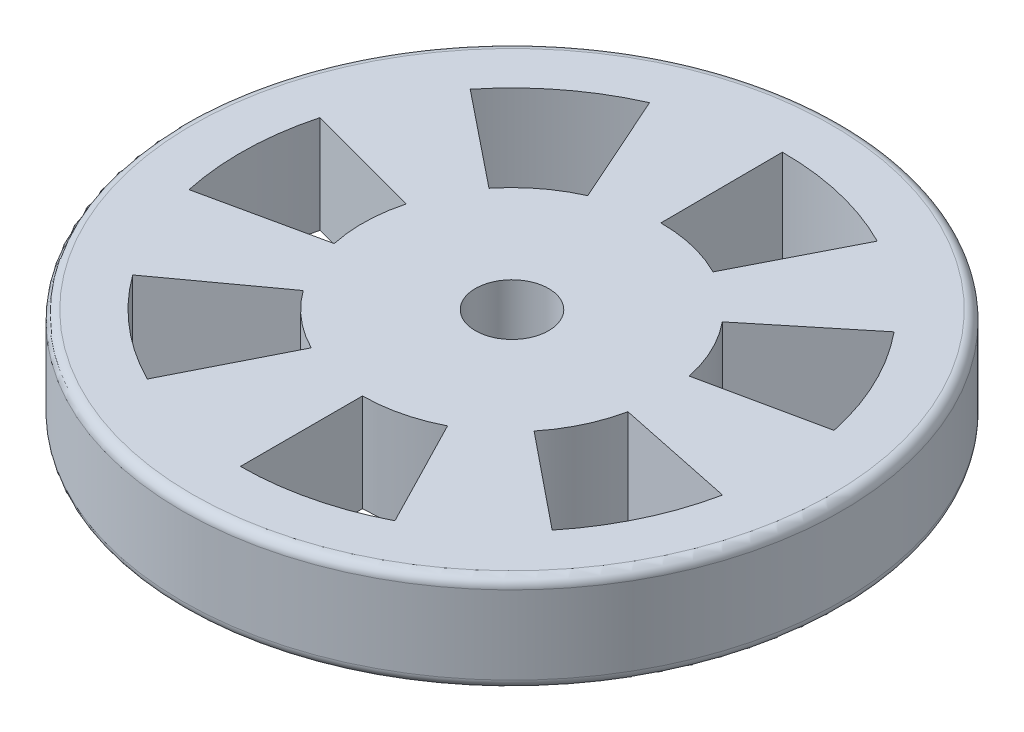
ISO-10303-21;
HEADER;
FILE_DESCRIPTION(('STEP AP214'),'2;1');
FILE_NAME('part.step','',(''),(''),'','','');
FILE_SCHEMA(('AUTOMOTIVE_DESIGN { 1 0 10303 214 1 1 1 1 }'));
ENDSEC;
DATA;
#1=APPLICATION_CONTEXT('core data for automotive mechanical design processes');
#2=APPLICATION_PROTOCOL_DEFINITION('international standard','automotive_design',2000,#1);
#3=PRODUCT_CONTEXT('',#1,'mechanical');
#4=PRODUCT('Part','Part','',(#3));
#5=PRODUCT_RELATED_PRODUCT_CATEGORY('part','',(#4));
#6=PRODUCT_DEFINITION_FORMATION('','',#4);
#7=PRODUCT_DEFINITION_CONTEXT('part definition',#1,'design');
#8=PRODUCT_DEFINITION('design','',#6,#7);
#9=PRODUCT_DEFINITION_SHAPE('','',#8);
#10=(LENGTH_UNIT() NAMED_UNIT(*) SI_UNIT(.MILLI.,.METRE.));
#11=(NAMED_UNIT(*) PLANE_ANGLE_UNIT() SI_UNIT($,.RADIAN.));
#12=(NAMED_UNIT(*) SI_UNIT($,.STERADIAN.) SOLID_ANGLE_UNIT());
#13=UNCERTAINTY_MEASURE_WITH_UNIT(LENGTH_MEASURE(1.E-05),#10,'distance_accuracy_value','');
#14=(GEOMETRIC_REPRESENTATION_CONTEXT(3) GLOBAL_UNCERTAINTY_ASSIGNED_CONTEXT((#13)) GLOBAL_UNIT_ASSIGNED_CONTEXT((#10,
#11,#12)) REPRESENTATION_CONTEXT('',''));
#15=CARTESIAN_POINT('',(0.,0.,0.));
#16=DIRECTION('',(0.,0.,1.));
#17=DIRECTION('',(1.,0.,0.));
#18=AXIS2_PLACEMENT_3D('',#15,#16,#17);
#19=CARTESIAN_POINT('',(0.,20.,0.));
#20=DIRECTION('',(0.,-1.,0.));
#21=DIRECTION('',(0.,0.,-1.));
#22=AXIS2_PLACEMENT_3D('',#19,#20,#21);
#23=CYLINDRICAL_SURFACE('',#22,67.5);
#24=CARTESIAN_POINT('',(0.,2.,0.));
#25=DIRECTION('',(0.,1.,0.));
#26=DIRECTION('',(0.,0.,1.));
#27=AXIS2_PLACEMENT_3D('',#24,#25,#26);
#28=CIRCLE('',#27,67.5);
#29=CARTESIAN_POINT('',(0.,2.,67.5));
#30=VERTEX_POINT('',#29);
#31=EDGE_CURVE('E459',#30,#30,#28,.T.);
#32=ORIENTED_EDGE('',*,*,#31,.T.);
#33=EDGE_LOOP('',(#32));
#34=FACE_BOUND('',#33,.T.);
#35=CARTESIAN_POINT('',(0.,18.,0.));
#36=DIRECTION('',(0.,1.,0.));
#37=DIRECTION('',(0.,0.,1.));
#38=AXIS2_PLACEMENT_3D('',#35,#36,#37);
#39=CIRCLE('',#38,67.5);
#40=CARTESIAN_POINT('',(0.,18.,67.5));
#41=VERTEX_POINT('',#40);
#42=EDGE_CURVE('E454',#41,#41,#39,.F.);
#43=ORIENTED_EDGE('',*,*,#42,.T.);
#44=EDGE_LOOP('',(#43));
#45=FACE_BOUND('',#44,.T.);
#46=ADVANCED_FACE('F34',(#34,#45),#23,.T.);
#47=CARTESIAN_POINT('',(0.,20.,0.));
#48=DIRECTION('',(0.,1.,0.));
#49=DIRECTION('',(0.,0.,1.));
#50=AXIS2_PLACEMENT_3D('',#47,#48,#49);
#51=PLANE('',#50);
#52=CARTESIAN_POINT('',(0.,20.,0.));
#53=DIRECTION('',(0.,1.,0.));
#54=DIRECTION('',(0.80901699437494,0.,-0.587785252292483));
#55=AXIS2_PLACEMENT_3D('',#52,#53,#54);
#56=CIRCLE('',#55,30.617728898153);
#57=CARTESIAN_POINT('',(-24.7702630077705,20.,17.9966495050237));
#58=VERTEX_POINT('',#57);
#59=CARTESIAN_POINT('',(-13.7823703581596,20.,27.3402924306108));
#60=VERTEX_POINT('',#59);
#61=EDGE_CURVE('E358',#58,#60,#56,.T.);
#62=ORIENTED_EDGE('',*,*,#61,.T.);
#63=DIRECTION('',(-0.450143457864081,0.,0.892956251639557));
#64=VECTOR('',#63,1.);
#65=CARTESIAN_POINT('',(-13.7823703581596,20.,27.3402924306108));
#66=LINE('',#65,#64);
#67=CARTESIAN_POINT('',(-25.0359568047616,20.,49.6641987215998));
#68=VERTEX_POINT('',#67);
#69=EDGE_CURVE('E361',#60,#68,#66,.T.);
#70=ORIENTED_EDGE('',*,*,#69,.T.);
#71=CARTESIAN_POINT('',(0.,20.,0.));
#72=DIRECTION('',(0.,-1.,0.));
#73=DIRECTION('',(0.80901699437494,0.,-0.587785252292483));
#74=AXIS2_PLACEMENT_3D('',#71,#72,#73);
#75=CIRCLE('',#74,55.617728898153);
#76=CARTESIAN_POINT('',(-44.995687867144,20.,32.6912808123358));
#77=VERTEX_POINT('',#76);
#78=EDGE_CURVE('E49',#68,#77,#75,.T.);
#79=ORIENTED_EDGE('',*,*,#78,.T.);
#80=DIRECTION('',(0.80901699437494,0.,-0.587785252292483));
#81=VECTOR('',#80,1.);
#82=CARTESIAN_POINT('',(-24.7702630077705,20.,17.9966495050237));
#83=LINE('',#82,#81);
#84=EDGE_CURVE('E366',#77,#58,#83,.T.);
#85=ORIENTED_EDGE('',*,*,#84,.T.);
#86=EDGE_LOOP('',(#62,#70,#79,#85));
#87=FACE_BOUND('',#86,.T.);
#88=CARTESIAN_POINT('',(0.,20.,0.));
#89=DIRECTION('',(0.,1.,0.));
#90=DIRECTION('',(0.965925826289071,0.,0.258819045102511));
#91=AXIS2_PLACEMENT_3D('',#88,#89,#90);
#92=CIRCLE('',#91,30.617728898153);
#93=CARTESIAN_POINT('',(-29.5744550850432,20.,-7.92445135662751));
#94=VERTEX_POINT('',#93);
#95=CARTESIAN_POINT('',(-29.9209245508925,20.,6.49489006070088));
#96=VERTEX_POINT('',#95);
#97=EDGE_CURVE('E328',#94,#96,#92,.T.);
#98=ORIENTED_EDGE('',*,*,#97,.T.);
#99=DIRECTION('',(-0.977241801650987,0.,0.212128407116855));
#100=VECTOR('',#99,1.);
#101=CARTESIAN_POINT('',(-29.9209245508925,20.,6.49489006070088));
#102=LINE('',#101,#100);
#103=CARTESIAN_POINT('',(-54.3519695921672,20.,11.7981002386223));
#104=VERTEX_POINT('',#103);
#105=EDGE_CURVE('E331',#96,#104,#102,.T.);
#106=ORIENTED_EDGE('',*,*,#105,.T.);
#107=CARTESIAN_POINT('',(0.,20.,0.));
#108=DIRECTION('',(0.,-1.,0.));
#109=DIRECTION('',(0.965925826289071,0.,0.258819045102511));
#110=AXIS2_PLACEMENT_3D('',#107,#108,#109);
#111=CIRCLE('',#110,55.617728898153);
#112=CARTESIAN_POINT('',(-53.72260074227,20.,-14.3949274841903));
#113=VERTEX_POINT('',#112);
#114=EDGE_CURVE('E57',#104,#113,#111,.T.);
#115=ORIENTED_EDGE('',*,*,#114,.T.);
#116=DIRECTION('',(0.965925826289071,0.,0.258819045102511));
#117=VECTOR('',#116,1.);
#118=CARTESIAN_POINT('',(-29.5744550850432,20.,-7.92445135662751));
#119=LINE('',#118,#117);
#120=EDGE_CURVE('E336',#113,#94,#119,.T.);
#121=ORIENTED_EDGE('',*,*,#120,.T.);
#122=EDGE_LOOP('',(#98,#106,#115,#121));
#123=FACE_BOUND('',#122,.T.);
#124=CARTESIAN_POINT('',(0.,20.,0.));
#125=DIRECTION('',(0.,1.,0.));
#126=DIRECTION('',(0.406736643075808,0.,0.913545457642598));
#127=AXIS2_PLACEMENT_3D('',#124,#125,#126);
#128=CIRCLE('',#127,30.617728898153);
#129=CARTESIAN_POINT('',(-12.4533522706399,20.,-27.9706871582401));
#130=VERTEX_POINT('',#129);
#131=CARTESIAN_POINT('',(-23.877325519721,20.,-19.1655589249589));
#132=VERTEX_POINT('',#131);
#133=EDGE_CURVE('E296',#130,#132,#128,.T.);
#134=ORIENTED_EDGE('',*,*,#133,.T.);
#135=DIRECTION('',(-0.779852927666409,0.,-0.625962787400442));
#136=VECTOR('',#135,1.);
#137=CARTESIAN_POINT('',(-23.877325519721,20.,-19.1655589249589));
#138=LINE('',#137,#136);
#139=CARTESIAN_POINT('',(-43.3736487113812,20.,-34.8146286099699));
#140=VERTEX_POINT('',#139);
#141=EDGE_CURVE('E299',#132,#140,#138,.T.);
#142=ORIENTED_EDGE('',*,*,#141,.T.);
#143=CARTESIAN_POINT('',(0.,20.,0.));
#144=DIRECTION('',(0.,-1.,0.));
#145=DIRECTION('',(0.406736643075808,0.,0.913545457642598));
#146=AXIS2_PLACEMENT_3D('',#143,#144,#145);
#147=CIRCLE('',#146,55.617728898153);
#148=CARTESIAN_POINT('',(-22.6217683475351,20.,-50.8093235993051));
#149=VERTEX_POINT('',#148);
#150=EDGE_CURVE('E303',#140,#149,#147,.T.);
#151=ORIENTED_EDGE('',*,*,#150,.T.);
#152=DIRECTION('',(0.406736643075808,0.,0.913545457642598));
#153=VECTOR('',#152,1.);
#154=CARTESIAN_POINT('',(-12.4533522706399,20.,-27.9706871582401));
#155=LINE('',#154,#153);
#156=EDGE_CURVE('E306',#149,#130,#155,.T.);
#157=ORIENTED_EDGE('',*,*,#156,.T.);
#158=EDGE_LOOP('',(#134,#142,#151,#157));
#159=FACE_BOUND('',#158,.T.);
#160=CARTESIAN_POINT('',(0.,20.,0.));
#161=DIRECTION('',(0.,1.,0.));
#162=DIRECTION('',(-0.978147600733805,0.,0.207911690817763));
#163=AXIS2_PLACEMENT_3D('',#160,#161,#162);
#164=CIRCLE('',#163,30.617728898153);
#165=CARTESIAN_POINT('',(29.9486580616464,20.,-6.36578378421487));
#166=VERTEX_POINT('',#165);
#167=CARTESIAN_POINT('',(23.7111206001822,20.,-19.3708049074995));
#168=VERTEX_POINT('',#167);
#169=EDGE_CURVE('E264',#166,#168,#164,.T.);
#170=ORIENTED_EDGE('',*,*,#169,.T.);
#171=DIRECTION('',(0.774424539424693,0.,-0.632666288604706));
#172=VECTOR('',#171,1.);
#173=CARTESIAN_POINT('',(23.7111206001822,20.,-19.3708049074995));
#174=LINE('',#173,#172);
#175=CARTESIAN_POINT('',(43.0717340857995,20.,-35.1874621226171));
#176=VERTEX_POINT('',#175);
#177=EDGE_CURVE('E267',#168,#176,#174,.T.);
#178=ORIENTED_EDGE('',*,*,#177,.T.);
#179=CARTESIAN_POINT('',(0.,20.,0.));
#180=DIRECTION('',(0.,-1.,0.));
#181=DIRECTION('',(-0.978147600733805,0.,0.207911690817763));
#182=AXIS2_PLACEMENT_3D('',#179,#180,#181);
#183=CIRCLE('',#182,55.617728898153);
#184=CARTESIAN_POINT('',(54.4023480799916,20.,-11.563576054659));
#185=VERTEX_POINT('',#184);
#186=EDGE_CURVE('E271',#176,#185,#183,.T.);
#187=ORIENTED_EDGE('',*,*,#186,.T.);
#188=DIRECTION('',(-0.978147600733805,0.,0.207911690817763));
#189=VECTOR('',#188,1.);
#190=CARTESIAN_POINT('',(29.9486580616464,20.,-6.36578378421487));
#191=LINE('',#190,#189);
#192=EDGE_CURVE('E274',#185,#166,#191,.T.);
#193=ORIENTED_EDGE('',*,*,#192,.T.);
#194=EDGE_LOOP('',(#170,#178,#187,#193));
#195=FACE_BOUND('',#194,.T.);
#196=CARTESIAN_POINT('',(0.,20.,0.));
#197=DIRECTION('',(0.,1.,0.));
#198=DIRECTION('',(-0.453990499739541,0.,0.891006524188371));
#199=AXIS2_PLACEMENT_3D('',#196,#197,#198);
#200=CIRCLE('',#199,30.617728898153);
#201=CARTESIAN_POINT('',(13.9001580433623,20.,-27.2805962040851));
#202=VERTEX_POINT('',#201);
#203=CARTESIAN_POINT('',(-0.132051115697628,20.,-30.6174441353885));
#204=VERTEX_POINT('',#203);
#205=EDGE_CURVE('E223',#202,#204,#200,.T.);
#206=ORIENTED_EDGE('',*,*,#205,.T.);
#207=DIRECTION('',(-0.00431289714978167,0.,-0.999990699415837));
#208=VECTOR('',#207,1.);
#209=CARTESIAN_POINT('',(-0.132051115697628,20.,-30.6174441353885));
#210=LINE('',#209,#208);
#211=CARTESIAN_POINT('',(-0.23987354444217,20.,-55.6172116207844));
#212=VERTEX_POINT('',#211);
#213=EDGE_CURVE('E235',#204,#212,#210,.T.);
#214=ORIENTED_EDGE('',*,*,#213,.T.);
#215=CARTESIAN_POINT('',(0.,20.,0.));
#216=DIRECTION('',(0.,-1.,0.));
#217=DIRECTION('',(-0.453990499739541,0.,0.891006524188371));
#218=AXIS2_PLACEMENT_3D('',#215,#216,#217);
#219=CIRCLE('',#218,55.617728898153);
#220=CARTESIAN_POINT('',(25.2499205368508,20.,-49.5557593087944));
#221=VERTEX_POINT('',#220);
#222=EDGE_CURVE('E239',#212,#221,#219,.T.);
#223=ORIENTED_EDGE('',*,*,#222,.T.);
#224=DIRECTION('',(-0.453990499739541,0.,0.891006524188371));
#225=VECTOR('',#224,1.);
#226=CARTESIAN_POINT('',(13.9001580433623,20.,-27.2805962040851));
#227=LINE('',#226,#225);
#228=EDGE_CURVE('E231',#221,#202,#227,.T.);
#229=ORIENTED_EDGE('',*,*,#228,.T.);
#230=EDGE_LOOP('',(#206,#214,#223,#229));
#231=FACE_BOUND('',#230,.T.);
#232=CARTESIAN_POINT('',(0.,20.,0.));
#233=DIRECTION('',(0.,1.,0.));
#234=DIRECTION('',(-0.777145961456972,0.,-0.629320391049836));
#235=AXIS2_PLACEMENT_3D('',#232,#233,#234);
#236=CIRCLE('',#235,30.617728898153);
#237=CARTESIAN_POINT('',(23.794444362184,20.,19.2683611232435));
#238=VERTEX_POINT('',#237);
#239=CARTESIAN_POINT('',(29.9758344923706,20.,6.23655909671318));
#240=VERTEX_POINT('',#239);
#241=EDGE_CURVE('E387',#238,#240,#236,.T.);
#242=ORIENTED_EDGE('',*,*,#241,.T.);
#243=DIRECTION('',(0.979035205128455,0.,0.203691107118314));
#244=VECTOR('',#243,1.);
#245=CARTESIAN_POINT('',(29.9758344923706,20.,6.23655909671318));
#246=LINE('',#245,#244);
#247=CARTESIAN_POINT('',(54.451714620582,20.,11.328836774671));
#248=VERTEX_POINT('',#247);
#249=EDGE_CURVE('E390',#240,#248,#246,.T.);
#250=ORIENTED_EDGE('',*,*,#249,.T.);
#251=CARTESIAN_POINT('',(0.,20.,0.));
#252=DIRECTION('',(0.,-1.,0.));
#253=DIRECTION('',(-0.777145961456972,0.,-0.629320391049836));
#254=AXIS2_PLACEMENT_3D('',#251,#252,#253);
#255=CIRCLE('',#254,55.617728898153);
#256=CARTESIAN_POINT('',(43.2230933986083,20.,35.0013708994894));
#257=VERTEX_POINT('',#256);
#258=EDGE_CURVE('E394',#248,#257,#255,.T.);
#259=ORIENTED_EDGE('',*,*,#258,.T.);
#260=DIRECTION('',(-0.777145961456972,0.,-0.629320391049836));
#261=VECTOR('',#260,1.);
#262=CARTESIAN_POINT('',(23.794444362184,20.,19.2683611232435));
#263=LINE('',#262,#261);
#264=EDGE_CURVE('E397',#257,#238,#263,.T.);
#265=ORIENTED_EDGE('',*,*,#264,.T.);
#266=EDGE_LOOP('',(#242,#250,#259,#265));
#267=FACE_BOUND('',#266,.T.);
#268=CARTESIAN_POINT('',(0.,20.,0.));
#269=DIRECTION('',(0.,1.,0.));
#270=DIRECTION('',(0.,0.,-1.));
#271=AXIS2_PLACEMENT_3D('',#268,#269,#270);
#272=CIRCLE('',#271,30.617728898153);
#273=CARTESIAN_POINT('',(0.,20.,30.617728898153));
#274=VERTEX_POINT('',#273);
#275=CARTESIAN_POINT('',(14.0176871693854,20.,27.2203925265974));
#276=VERTEX_POINT('',#275);
#277=EDGE_CURVE('E419',#274,#276,#272,.T.);
#278=ORIENTED_EDGE('',*,*,#277,.T.);
#279=DIRECTION('',(0.457829096861298,0.,0.889040222974848));
#280=VECTOR('',#279,1.);
#281=CARTESIAN_POINT('',(14.0176871693854,20.,27.2203925265974));
#282=LINE('',#281,#280);
#283=CARTESIAN_POINT('',(25.4634145909179,20.,49.4463981009686));
#284=VERTEX_POINT('',#283);
#285=EDGE_CURVE('E422',#276,#284,#282,.T.);
#286=ORIENTED_EDGE('',*,*,#285,.T.);
#287=CARTESIAN_POINT('',(0.,20.,0.));
#288=DIRECTION('',(0.,-1.,0.));
#289=DIRECTION('',(0.,0.,-1.));
#290=AXIS2_PLACEMENT_3D('',#287,#288,#289);
#291=CIRCLE('',#290,55.617728898153);
#292=CARTESIAN_POINT('',(0.,20.,55.617728898153));
#293=VERTEX_POINT('',#292);
#294=EDGE_CURVE('E426',#284,#293,#291,.T.);
#295=ORIENTED_EDGE('',*,*,#294,.T.);
#296=DIRECTION('',(0.,0.,-1.));
#297=VECTOR('',#296,1.);
#298=CARTESIAN_POINT('',(0.,20.,30.617728898153));
#299=LINE('',#298,#297);
#300=EDGE_CURVE('E429',#293,#274,#299,.T.);
#301=ORIENTED_EDGE('',*,*,#300,.T.);
#302=EDGE_LOOP('',(#278,#286,#295,#301));
#303=FACE_BOUND('',#302,.T.);
#304=CARTESIAN_POINT('',(0.,20.,0.));
#305=DIRECTION('',(0.,1.,0.));
#306=DIRECTION('',(0.,0.,1.));
#307=AXIS2_PLACEMENT_3D('',#304,#305,#306);
#308=CIRCLE('',#307,7.5);
#309=CARTESIAN_POINT('',(0.,20.,7.5));
#310=VERTEX_POINT('',#309);
#311=EDGE_CURVE('E444',#310,#310,#308,.T.);
#312=ORIENTED_EDGE('',*,*,#311,.F.);
#313=EDGE_LOOP('',(#312));
#314=FACE_BOUND('',#313,.T.);
#315=CARTESIAN_POINT('',(0.,20.,0.));
#316=DIRECTION('',(0.,1.,0.));
#317=DIRECTION('',(0.,0.,1.));
#318=AXIS2_PLACEMENT_3D('',#315,#316,#317);
#319=CIRCLE('',#318,65.5);
#320=CARTESIAN_POINT('',(0.,20.,65.5));
#321=VERTEX_POINT('',#320);
#322=EDGE_CURVE('E11',#321,#321,#319,.T.);
#323=ORIENTED_EDGE('',*,*,#322,.T.);
#324=EDGE_LOOP('',(#323));
#325=FACE_BOUND('',#324,.T.);
#326=ADVANCED_FACE('F241',(#87,#123,#159,#195,#231,#267,#303,#314,#325),#51,.T.);
#327=CARTESIAN_POINT('',(0.,0.,0.));
#328=DIRECTION('',(0.,1.,0.));
#329=DIRECTION('',(0.,0.,1.));
#330=AXIS2_PLACEMENT_3D('',#327,#328,#329);
#331=PLANE('',#330);
#332=DIRECTION('',(-0.450143457864081,0.,0.892956251639557));
#333=VECTOR('',#332,1.);
#334=CARTESIAN_POINT('',(-13.7823703581596,0.,27.3402924306108));
#335=LINE('',#334,#333);
#336=CARTESIAN_POINT('',(-13.7823703581596,0.,27.3402924306108));
#337=VERTEX_POINT('',#336);
#338=CARTESIAN_POINT('',(-25.0359568047616,0.,49.6641987215998));
#339=VERTEX_POINT('',#338);
#340=EDGE_CURVE('E372',#337,#339,#335,.T.);
#341=ORIENTED_EDGE('',*,*,#340,.F.);
#342=CARTESIAN_POINT('',(0.,0.,0.));
#343=DIRECTION('',(0.,1.,0.));
#344=DIRECTION('',(0.80901699437494,0.,-0.587785252292483));
#345=AXIS2_PLACEMENT_3D('',#342,#343,#344);
#346=CIRCLE('',#345,30.617728898153);
#347=CARTESIAN_POINT('',(-24.7702630077705,0.,17.9966495050237));
#348=VERTEX_POINT('',#347);
#349=EDGE_CURVE('E370',#348,#337,#346,.T.);
#350=ORIENTED_EDGE('',*,*,#349,.F.);
#351=DIRECTION('',(0.80901699437494,0.,-0.587785252292483));
#352=VECTOR('',#351,1.);
#353=CARTESIAN_POINT('',(-24.7702630077705,0.,17.9966495050237));
#354=LINE('',#353,#352);
#355=CARTESIAN_POINT('',(-44.995687867144,0.,32.6912808123358));
#356=VERTEX_POINT('',#355);
#357=EDGE_CURVE('E362',#356,#348,#354,.T.);
#358=ORIENTED_EDGE('',*,*,#357,.F.);
#359=CARTESIAN_POINT('',(0.,0.,0.));
#360=DIRECTION('',(0.,-1.,0.));
#361=DIRECTION('',(0.80901699437494,0.,-0.587785252292483));
#362=AXIS2_PLACEMENT_3D('',#359,#360,#361);
#363=CIRCLE('',#362,55.617728898153);
#364=EDGE_CURVE('E375',#339,#356,#363,.T.);
#365=ORIENTED_EDGE('',*,*,#364,.F.);
#366=EDGE_LOOP('',(#341,#350,#358,#365));
#367=FACE_BOUND('',#366,.T.);
#368=DIRECTION('',(-0.977241801650987,0.,0.212128407116855));
#369=VECTOR('',#368,1.);
#370=CARTESIAN_POINT('',(-29.9209245508925,0.,6.49489006070088));
#371=LINE('',#370,#369);
#372=CARTESIAN_POINT('',(-29.9209245508925,0.,6.49489006070088));
#373=VERTEX_POINT('',#372);
#374=CARTESIAN_POINT('',(-54.3519695921672,0.,11.7981002386222));
#375=VERTEX_POINT('',#374);
#376=EDGE_CURVE('E342',#373,#375,#371,.T.);
#377=ORIENTED_EDGE('',*,*,#376,.F.);
#378=CARTESIAN_POINT('',(0.,0.,0.));
#379=DIRECTION('',(0.,1.,0.));
#380=DIRECTION('',(0.965925826289071,0.,0.258819045102511));
#381=AXIS2_PLACEMENT_3D('',#378,#379,#380);
#382=CIRCLE('',#381,30.617728898153);
#383=CARTESIAN_POINT('',(-29.5744550850432,0.,-7.92445135662751));
#384=VERTEX_POINT('',#383);
#385=EDGE_CURVE('E340',#384,#373,#382,.T.);
#386=ORIENTED_EDGE('',*,*,#385,.F.);
#387=DIRECTION('',(0.965925826289071,0.,0.258819045102511));
#388=VECTOR('',#387,1.);
#389=CARTESIAN_POINT('',(-29.5744550850432,0.,-7.92445135662751));
#390=LINE('',#389,#388);
#391=CARTESIAN_POINT('',(-53.72260074227,0.,-14.3949274841903));
#392=VERTEX_POINT('',#391);
#393=EDGE_CURVE('E332',#392,#384,#390,.T.);
#394=ORIENTED_EDGE('',*,*,#393,.F.);
#395=CARTESIAN_POINT('',(0.,0.,0.));
#396=DIRECTION('',(0.,-1.,0.));
#397=DIRECTION('',(0.965925826289071,0.,0.258819045102511));
#398=AXIS2_PLACEMENT_3D('',#395,#396,#397);
#399=CIRCLE('',#398,55.617728898153);
#400=EDGE_CURVE('E346',#375,#392,#399,.T.);
#401=ORIENTED_EDGE('',*,*,#400,.F.);
#402=EDGE_LOOP('',(#377,#386,#394,#401));
#403=FACE_BOUND('',#402,.T.);
#404=DIRECTION('',(-0.779852927666409,0.,-0.625962787400442));
#405=VECTOR('',#404,1.);
#406=CARTESIAN_POINT('',(-23.877325519721,0.,-19.1655589249589));
#407=LINE('',#406,#405);
#408=CARTESIAN_POINT('',(-23.877325519721,0.,-19.1655589249589));
#409=VERTEX_POINT('',#408);
#410=CARTESIAN_POINT('',(-43.3736487113812,0.,-34.8146286099699));
#411=VERTEX_POINT('',#410);
#412=EDGE_CURVE('E312',#409,#411,#407,.T.);
#413=ORIENTED_EDGE('',*,*,#412,.F.);
#414=CARTESIAN_POINT('',(0.,0.,0.));
#415=DIRECTION('',(0.,1.,0.));
#416=DIRECTION('',(0.406736643075808,0.,0.913545457642598));
#417=AXIS2_PLACEMENT_3D('',#414,#415,#416);
#418=CIRCLE('',#417,30.617728898153);
#419=CARTESIAN_POINT('',(-12.4533522706399,0.,-27.9706871582401));
#420=VERTEX_POINT('',#419);
#421=EDGE_CURVE('E310',#420,#409,#418,.T.);
#422=ORIENTED_EDGE('',*,*,#421,.F.);
#423=DIRECTION('',(0.406736643075808,0.,0.913545457642598));
#424=VECTOR('',#423,1.);
#425=CARTESIAN_POINT('',(-12.4533522706399,0.,-27.9706871582401));
#426=LINE('',#425,#424);
#427=CARTESIAN_POINT('',(-22.6217683475351,0.,-50.8093235993051));
#428=VERTEX_POINT('',#427);
#429=EDGE_CURVE('E300',#428,#420,#426,.T.);
#430=ORIENTED_EDGE('',*,*,#429,.F.);
#431=CARTESIAN_POINT('',(0.,0.,0.));
#432=DIRECTION('',(0.,-1.,0.));
#433=DIRECTION('',(0.406736643075808,0.,0.913545457642598));
#434=AXIS2_PLACEMENT_3D('',#431,#432,#433);
#435=CIRCLE('',#434,55.617728898153);
#436=EDGE_CURVE('E316',#411,#428,#435,.T.);
#437=ORIENTED_EDGE('',*,*,#436,.F.);
#438=EDGE_LOOP('',(#413,#422,#430,#437));
#439=FACE_BOUND('',#438,.T.);
#440=DIRECTION('',(0.774424539424693,0.,-0.632666288604706));
#441=VECTOR('',#440,1.);
#442=CARTESIAN_POINT('',(23.7111206001822,0.,-19.3708049074995));
#443=LINE('',#442,#441);
#444=CARTESIAN_POINT('',(23.7111206001822,0.,-19.3708049074995));
#445=VERTEX_POINT('',#444);
#446=CARTESIAN_POINT('',(43.0717340857995,0.,-35.1874621226171));
#447=VERTEX_POINT('',#446);
#448=EDGE_CURVE('E279',#445,#447,#443,.T.);
#449=ORIENTED_EDGE('',*,*,#448,.F.);
#450=CARTESIAN_POINT('',(0.,0.,0.));
#451=DIRECTION('',(0.,1.,0.));
#452=DIRECTION('',(-0.978147600733805,0.,0.207911690817763));
#453=AXIS2_PLACEMENT_3D('',#450,#451,#452);
#454=CIRCLE('',#453,30.617728898153);
#455=CARTESIAN_POINT('',(29.9486580616464,0.,-6.36578378421487));
#456=VERTEX_POINT('',#455);
#457=EDGE_CURVE('E260',#456,#445,#454,.T.);
#458=ORIENTED_EDGE('',*,*,#457,.F.);
#459=DIRECTION('',(-0.978147600733805,0.,0.207911690817763));
#460=VECTOR('',#459,1.);
#461=CARTESIAN_POINT('',(29.9486580616464,0.,-6.36578378421487));
#462=LINE('',#461,#460);
#463=CARTESIAN_POINT('',(54.4023480799916,0.,-11.563576054659));
#464=VERTEX_POINT('',#463);
#465=EDGE_CURVE('E268',#464,#456,#462,.T.);
#466=ORIENTED_EDGE('',*,*,#465,.F.);
#467=CARTESIAN_POINT('',(0.,0.,0.));
#468=DIRECTION('',(0.,-1.,0.));
#469=DIRECTION('',(-0.978147600733805,0.,0.207911690817763));
#470=AXIS2_PLACEMENT_3D('',#467,#468,#469);
#471=CIRCLE('',#470,55.617728898153);
#472=EDGE_CURVE('E282',#447,#464,#471,.T.);
#473=ORIENTED_EDGE('',*,*,#472,.F.);
#474=EDGE_LOOP('',(#449,#458,#466,#473));
#475=FACE_BOUND('',#474,.T.);
#476=DIRECTION('',(-0.00431289714978167,0.,-0.999990699415837));
#477=VECTOR('',#476,1.);
#478=CARTESIAN_POINT('',(-0.132051115697628,0.,-30.6174441353885));
#479=LINE('',#478,#477);
#480=CARTESIAN_POINT('',(-0.132051115697628,0.,-30.6174441353885));
#481=VERTEX_POINT('',#480);
#482=CARTESIAN_POINT('',(-0.23987354444217,0.,-55.6172116207844));
#483=VERTEX_POINT('',#482);
#484=EDGE_CURVE('E253',#481,#483,#479,.T.);
#485=ORIENTED_EDGE('',*,*,#484,.F.);
#486=CARTESIAN_POINT('',(0.,0.,0.));
#487=DIRECTION('',(0.,1.,0.));
#488=DIRECTION('',(-0.453990499739541,0.,0.891006524188371));
#489=AXIS2_PLACEMENT_3D('',#486,#487,#488);
#490=CIRCLE('',#489,30.617728898153);
#491=CARTESIAN_POINT('',(13.9001580433623,0.,-27.2805962040851));
#492=VERTEX_POINT('',#491);
#493=EDGE_CURVE('E226',#492,#481,#490,.T.);
#494=ORIENTED_EDGE('',*,*,#493,.F.);
#495=DIRECTION('',(-0.453990499739541,0.,0.891006524188371));
#496=VECTOR('',#495,1.);
#497=CARTESIAN_POINT('',(13.9001580433623,0.,-27.2805962040851));
#498=LINE('',#497,#496);
#499=CARTESIAN_POINT('',(25.2499205368508,0.,-49.5557593087944));
#500=VERTEX_POINT('',#499);
#501=EDGE_CURVE('E244',#500,#492,#498,.T.);
#502=ORIENTED_EDGE('',*,*,#501,.F.);
#503=CARTESIAN_POINT('',(0.,0.,0.));
#504=DIRECTION('',(0.,-1.,0.));
#505=DIRECTION('',(-0.453990499739541,0.,0.891006524188371));
#506=AXIS2_PLACEMENT_3D('',#503,#504,#505);
#507=CIRCLE('',#506,55.617728898153);
#508=EDGE_CURVE('E247',#483,#500,#507,.T.);
#509=ORIENTED_EDGE('',*,*,#508,.F.);
#510=EDGE_LOOP('',(#485,#494,#502,#509));
#511=FACE_BOUND('',#510,.T.);
#512=DIRECTION('',(0.979035205128455,0.,0.203691107118314));
#513=VECTOR('',#512,1.);
#514=CARTESIAN_POINT('',(29.9758344923706,0.,6.23655909671318));
#515=LINE('',#514,#513);
#516=CARTESIAN_POINT('',(29.9758344923706,0.,6.23655909671318));
#517=VERTEX_POINT('',#516);
#518=CARTESIAN_POINT('',(54.451714620582,0.,11.328836774671));
#519=VERTEX_POINT('',#518);
#520=EDGE_CURVE('E402',#517,#519,#515,.T.);
#521=ORIENTED_EDGE('',*,*,#520,.F.);
#522=CARTESIAN_POINT('',(0.,0.,0.));
#523=DIRECTION('',(0.,1.,0.));
#524=DIRECTION('',(-0.777145961456972,0.,-0.629320391049836));
#525=AXIS2_PLACEMENT_3D('',#522,#523,#524);
#526=CIRCLE('',#525,30.617728898153);
#527=CARTESIAN_POINT('',(23.794444362184,0.,19.2683611232435));
#528=VERTEX_POINT('',#527);
#529=EDGE_CURVE('E289',#528,#517,#526,.T.);
#530=ORIENTED_EDGE('',*,*,#529,.F.);
#531=DIRECTION('',(-0.777145961456972,0.,-0.629320391049836));
#532=VECTOR('',#531,1.);
#533=CARTESIAN_POINT('',(23.794444362184,0.,19.2683611232435));
#534=LINE('',#533,#532);
#535=CARTESIAN_POINT('',(43.2230933986083,0.,35.0013708994894));
#536=VERTEX_POINT('',#535);
#537=EDGE_CURVE('E391',#536,#528,#534,.T.);
#538=ORIENTED_EDGE('',*,*,#537,.F.);
#539=CARTESIAN_POINT('',(0.,0.,0.));
#540=DIRECTION('',(0.,-1.,0.));
#541=DIRECTION('',(-0.777145961456972,0.,-0.629320391049836));
#542=AXIS2_PLACEMENT_3D('',#539,#540,#541);
#543=CIRCLE('',#542,55.617728898153);
#544=EDGE_CURVE('E405',#519,#536,#543,.T.);
#545=ORIENTED_EDGE('',*,*,#544,.F.);
#546=EDGE_LOOP('',(#521,#530,#538,#545));
#547=FACE_BOUND('',#546,.T.);
#548=DIRECTION('',(0.457829096861298,0.,0.889040222974848));
#549=VECTOR('',#548,1.);
#550=CARTESIAN_POINT('',(14.0176871693854,0.,27.2203925265974));
#551=LINE('',#550,#549);
#552=CARTESIAN_POINT('',(14.0176871693854,0.,27.2203925265974));
#553=VERTEX_POINT('',#552);
#554=CARTESIAN_POINT('',(25.4634145909179,0.,49.4463981009686));
#555=VERTEX_POINT('',#554);
#556=EDGE_CURVE('E434',#553,#555,#551,.T.);
#557=ORIENTED_EDGE('',*,*,#556,.F.);
#558=CARTESIAN_POINT('',(0.,0.,0.));
#559=DIRECTION('',(0.,1.,0.));
#560=DIRECTION('',(0.,0.,-1.));
#561=AXIS2_PLACEMENT_3D('',#558,#559,#560);
#562=CIRCLE('',#561,30.617728898153);
#563=CARTESIAN_POINT('',(0.,0.,30.617728898153));
#564=VERTEX_POINT('',#563);
#565=EDGE_CURVE('E412',#564,#553,#562,.T.);
#566=ORIENTED_EDGE('',*,*,#565,.F.);
#567=DIRECTION('',(0.,0.,-1.));
#568=VECTOR('',#567,1.);
#569=CARTESIAN_POINT('',(0.,0.,30.617728898153));
#570=LINE('',#569,#568);
#571=CARTESIAN_POINT('',(0.,0.,55.617728898153));
#572=VERTEX_POINT('',#571);
#573=EDGE_CURVE('E423',#572,#564,#570,.T.);
#574=ORIENTED_EDGE('',*,*,#573,.F.);
#575=CARTESIAN_POINT('',(0.,0.,0.));
#576=DIRECTION('',(0.,-1.,0.));
#577=DIRECTION('',(0.,0.,-1.));
#578=AXIS2_PLACEMENT_3D('',#575,#576,#577);
#579=CIRCLE('',#578,55.617728898153);
#580=EDGE_CURVE('E437',#555,#572,#579,.T.);
#581=ORIENTED_EDGE('',*,*,#580,.F.);
#582=EDGE_LOOP('',(#557,#566,#574,#581));
#583=FACE_BOUND('',#582,.T.);
#584=CARTESIAN_POINT('',(0.,0.,0.));
#585=DIRECTION('',(0.,1.,0.));
#586=DIRECTION('',(0.,0.,1.));
#587=AXIS2_PLACEMENT_3D('',#584,#585,#586);
#588=CIRCLE('',#587,7.5);
#589=CARTESIAN_POINT('',(0.,0.,7.5));
#590=VERTEX_POINT('',#589);
#591=EDGE_CURVE('E451',#590,#590,#588,.T.);
#592=ORIENTED_EDGE('',*,*,#591,.T.);
#593=EDGE_LOOP('',(#592));
#594=FACE_BOUND('',#593,.T.);
#595=CARTESIAN_POINT('',(0.,0.,0.));
#596=DIRECTION('',(0.,1.,0.));
#597=DIRECTION('',(0.,0.,1.));
#598=AXIS2_PLACEMENT_3D('',#595,#596,#597);
#599=CIRCLE('',#598,65.5);
#600=CARTESIAN_POINT('',(0.,0.,65.5));
#601=VERTEX_POINT('',#600);
#602=EDGE_CURVE('E42',#601,#601,#599,.F.);
#603=ORIENTED_EDGE('',*,*,#602,.T.);
#604=EDGE_LOOP('',(#603));
#605=FACE_BOUND('',#604,.T.);
#606=ADVANCED_FACE('F464',(#367,#403,#439,#475,#511,#547,#583,#594,#605),#331,.F.);
#607=CARTESIAN_POINT('',(0.,2.,0.));
#608=DIRECTION('',(0.,1.,0.));
#609=DIRECTION('',(0.,0.,1.));
#610=AXIS2_PLACEMENT_3D('',#607,#608,#609);
#611=TOROIDAL_SURFACE('',#610,65.5,2.);
#612=ORIENTED_EDGE('',*,*,#602,.F.);
#613=EDGE_LOOP('',(#612));
#614=FACE_BOUND('',#613,.T.);
#615=ORIENTED_EDGE('',*,*,#31,.F.);
#616=EDGE_LOOP('',(#615));
#617=FACE_BOUND('',#616,.T.);
#618=ADVANCED_FACE('F466',(#614,#617),#611,.T.);
#619=CARTESIAN_POINT('',(0.,18.,0.));
#620=DIRECTION('',(0.,1.,0.));
#621=DIRECTION('',(0.,0.,1.));
#622=AXIS2_PLACEMENT_3D('',#619,#620,#621);
#623=TOROIDAL_SURFACE('',#622,65.5,2.);
#624=ORIENTED_EDGE('',*,*,#42,.F.);
#625=EDGE_LOOP('',(#624));
#626=FACE_BOUND('',#625,.T.);
#627=ORIENTED_EDGE('',*,*,#322,.F.);
#628=EDGE_LOOP('',(#627));
#629=FACE_BOUND('',#628,.T.);
#630=ADVANCED_FACE('F36',(#626,#629),#623,.T.);
#631=CARTESIAN_POINT('',(0.,0.,0.));
#632=DIRECTION('',(0.,1.,0.));
#633=DIRECTION('',(0.,0.,1.));
#634=AXIS2_PLACEMENT_3D('',#631,#632,#633);
#635=CYLINDRICAL_SURFACE('',#634,7.5);
#636=ORIENTED_EDGE('',*,*,#591,.F.);
#637=EDGE_LOOP('',(#636));
#638=FACE_BOUND('',#637,.T.);
#639=ORIENTED_EDGE('',*,*,#311,.T.);
#640=EDGE_LOOP('',(#639));
#641=FACE_BOUND('',#640,.T.);
#642=ADVANCED_FACE('F478',(#638,#641),#635,.F.);
#643=CARTESIAN_POINT('',(0.,20.,0.));
#644=DIRECTION('',(0.,-1.,0.));
#645=DIRECTION('',(0.,0.,-1.));
#646=AXIS2_PLACEMENT_3D('',#643,#644,#645);
#647=CYLINDRICAL_SURFACE('',#646,30.617728898153);
#648=ORIENTED_EDGE('',*,*,#565,.T.);
#649=DIRECTION('',(0.,-1.,0.));
#650=VECTOR('',#649,1.);
#651=CARTESIAN_POINT('',(14.0176871693854,20.,27.2203925265974));
#652=LINE('',#651,#650);
#653=EDGE_CURVE('E432',#276,#553,#652,.T.);
#654=ORIENTED_EDGE('',*,*,#653,.F.);
#655=ORIENTED_EDGE('',*,*,#277,.F.);
#656=DIRECTION('',(0.,-1.,0.));
#657=VECTOR('',#656,1.);
#658=CARTESIAN_POINT('',(0.,20.,30.617728898153));
#659=LINE('',#658,#657);
#660=EDGE_CURVE('E442',#274,#564,#659,.T.);
#661=ORIENTED_EDGE('',*,*,#660,.T.);
#662=EDGE_LOOP('',(#648,#654,#655,#661));
#663=FACE_BOUND('',#662,.T.);
#664=ADVANCED_FACE('F493',(#663),#647,.T.);
#665=CARTESIAN_POINT('',(0.,20.,30.617728898153));
#666=DIRECTION('',(-1.,0.,0.));
#667=DIRECTION('',(0.,0.,1.));
#668=AXIS2_PLACEMENT_3D('',#665,#666,#667);
#669=PLANE('',#668);
#670=ORIENTED_EDGE('',*,*,#573,.T.);
#671=ORIENTED_EDGE('',*,*,#660,.F.);
#672=ORIENTED_EDGE('',*,*,#300,.F.);
#673=DIRECTION('',(0.,-1.,0.));
#674=VECTOR('',#673,1.);
#675=CARTESIAN_POINT('',(0.,20.,55.617728898153));
#676=LINE('',#675,#674);
#677=EDGE_CURVE('E445',#293,#572,#676,.T.);
#678=ORIENTED_EDGE('',*,*,#677,.T.);
#679=EDGE_LOOP('',(#670,#671,#672,#678));
#680=FACE_BOUND('',#679,.T.);
#681=ADVANCED_FACE('F497',(#680),#669,.F.);
#682=CARTESIAN_POINT('',(0.,20.,0.));
#683=DIRECTION('',(0.,-1.,0.));
#684=DIRECTION('',(0.,0.,-1.));
#685=AXIS2_PLACEMENT_3D('',#682,#683,#684);
#686=CYLINDRICAL_SURFACE('',#685,55.617728898153);
#687=ORIENTED_EDGE('',*,*,#580,.T.);
#688=ORIENTED_EDGE('',*,*,#677,.F.);
#689=ORIENTED_EDGE('',*,*,#294,.F.);
#690=DIRECTION('',(0.,-1.,0.));
#691=VECTOR('',#690,1.);
#692=CARTESIAN_POINT('',(25.4634145909179,20.,49.4463981009686));
#693=LINE('',#692,#691);
#694=EDGE_CURVE('E447',#284,#555,#693,.T.);
#695=ORIENTED_EDGE('',*,*,#694,.T.);
#696=EDGE_LOOP('',(#687,#688,#689,#695));
#697=FACE_BOUND('',#696,.T.);
#698=ADVANCED_FACE('F503',(#697),#686,.F.);
#699=CARTESIAN_POINT('',(14.0176871693854,20.,27.2203925265974));
#700=DIRECTION('',(0.889040222974848,0.,-0.457829096861298));
#701=DIRECTION('',(-0.457829096861298,0.,-0.889040222974848));
#702=AXIS2_PLACEMENT_3D('',#699,#700,#701);
#703=PLANE('',#702);
#704=ORIENTED_EDGE('',*,*,#556,.T.);
#705=ORIENTED_EDGE('',*,*,#694,.F.);
#706=ORIENTED_EDGE('',*,*,#285,.F.);
#707=ORIENTED_EDGE('',*,*,#653,.T.);
#708=EDGE_LOOP('',(#704,#705,#706,#707));
#709=FACE_BOUND('',#708,.T.);
#710=ADVANCED_FACE('F499',(#709),#703,.F.);
#711=CARTESIAN_POINT('',(0.,20.,0.));
#712=DIRECTION('',(0.,-1.,0.));
#713=DIRECTION('',(0.,0.,-1.));
#714=AXIS2_PLACEMENT_3D('',#711,#712,#713);
#715=CYLINDRICAL_SURFACE('',#714,30.617728898153);
#716=ORIENTED_EDGE('',*,*,#529,.T.);
#717=DIRECTION('',(0.,-1.,0.));
#718=VECTOR('',#717,1.);
#719=CARTESIAN_POINT('',(29.9758344923706,20.,6.23655909671318));
#720=LINE('',#719,#718);
#721=EDGE_CURVE('E400',#240,#517,#720,.T.);
#722=ORIENTED_EDGE('',*,*,#721,.F.);
#723=ORIENTED_EDGE('',*,*,#241,.F.);
#724=DIRECTION('',(0.,-1.,0.));
#725=VECTOR('',#724,1.);
#726=CARTESIAN_POINT('',(23.794444362184,20.,19.2683611232435));
#727=LINE('',#726,#725);
#728=EDGE_CURVE('E410',#238,#528,#727,.T.);
#729=ORIENTED_EDGE('',*,*,#728,.T.);
#730=EDGE_LOOP('',(#716,#722,#723,#729));
#731=FACE_BOUND('',#730,.T.);
#732=ADVANCED_FACE('F502',(#731),#715,.T.);
#733=CARTESIAN_POINT('',(23.794444362184,20.,19.2683611232435));
#734=DIRECTION('',(-0.629320391049836,0.,0.777145961456972));
#735=DIRECTION('',(0.777145961456972,0.,0.629320391049836));
#736=AXIS2_PLACEMENT_3D('',#733,#734,#735);
#737=PLANE('',#736);
#738=ORIENTED_EDGE('',*,*,#537,.T.);
#739=ORIENTED_EDGE('',*,*,#728,.F.);
#740=ORIENTED_EDGE('',*,*,#264,.F.);
#741=DIRECTION('',(0.,-1.,0.));
#742=VECTOR('',#741,1.);
#743=CARTESIAN_POINT('',(43.2230933986083,20.,35.0013708994894));
#744=LINE('',#743,#742);
#745=EDGE_CURVE('E413',#257,#536,#744,.T.);
#746=ORIENTED_EDGE('',*,*,#745,.T.);
#747=EDGE_LOOP('',(#738,#739,#740,#746));
#748=FACE_BOUND('',#747,.T.);
#749=ADVANCED_FACE('F513',(#748),#737,.F.);
#750=CARTESIAN_POINT('',(0.,20.,0.));
#751=DIRECTION('',(0.,-1.,0.));
#752=DIRECTION('',(0.,0.,-1.));
#753=AXIS2_PLACEMENT_3D('',#750,#751,#752);
#754=CYLINDRICAL_SURFACE('',#753,55.617728898153);
#755=ORIENTED_EDGE('',*,*,#544,.T.);
#756=ORIENTED_EDGE('',*,*,#745,.F.);
#757=ORIENTED_EDGE('',*,*,#258,.F.);
#758=DIRECTION('',(0.,-1.,0.));
#759=VECTOR('',#758,1.);
#760=CARTESIAN_POINT('',(54.451714620582,20.,11.328836774671));
#761=LINE('',#760,#759);
#762=EDGE_CURVE('E415',#248,#519,#761,.T.);
#763=ORIENTED_EDGE('',*,*,#762,.T.);
#764=EDGE_LOOP('',(#755,#756,#757,#763));
#765=FACE_BOUND('',#764,.T.);
#766=ADVANCED_FACE('F518',(#765),#754,.F.);
#767=CARTESIAN_POINT('',(29.9758344923706,20.,6.23655909671318));
#768=DIRECTION('',(0.203691107118314,0.,-0.979035205128455));
#769=DIRECTION('',(-0.979035205128455,0.,-0.203691107118314));
#770=AXIS2_PLACEMENT_3D('',#767,#768,#769);
#771=PLANE('',#770);
#772=ORIENTED_EDGE('',*,*,#520,.T.);
#773=ORIENTED_EDGE('',*,*,#762,.F.);
#774=ORIENTED_EDGE('',*,*,#249,.F.);
#775=ORIENTED_EDGE('',*,*,#721,.T.);
#776=EDGE_LOOP('',(#772,#773,#774,#775));
#777=FACE_BOUND('',#776,.T.);
#778=ADVANCED_FACE('F515',(#777),#771,.F.);
#779=CARTESIAN_POINT('',(0.,20.,0.));
#780=DIRECTION('',(0.,-1.,0.));
#781=DIRECTION('',(0.,0.,-1.));
#782=AXIS2_PLACEMENT_3D('',#779,#780,#781);
#783=CYLINDRICAL_SURFACE('',#782,30.617728898153);
#784=ORIENTED_EDGE('',*,*,#493,.T.);
#785=DIRECTION('',(0.,-1.,0.));
#786=VECTOR('',#785,1.);
#787=CARTESIAN_POINT('',(-0.132051115697628,20.,-30.6174441353885));
#788=LINE('',#787,#786);
#789=EDGE_CURVE('E219',#204,#481,#788,.T.);
#790=ORIENTED_EDGE('',*,*,#789,.F.);
#791=ORIENTED_EDGE('',*,*,#205,.F.);
#792=DIRECTION('',(0.,-1.,0.));
#793=VECTOR('',#792,1.);
#794=CARTESIAN_POINT('',(13.9001580433623,20.,-27.2805962040851));
#795=LINE('',#794,#793);
#796=EDGE_CURVE('E258',#202,#492,#795,.T.);
#797=ORIENTED_EDGE('',*,*,#796,.T.);
#798=EDGE_LOOP('',(#784,#790,#791,#797));
#799=FACE_BOUND('',#798,.T.);
#800=ADVANCED_FACE('F221',(#799),#783,.T.);
#801=CARTESIAN_POINT('',(13.9001580433623,20.,-27.2805962040851));
#802=DIRECTION('',(0.891006524188371,0.,0.453990499739541));
#803=DIRECTION('',(0.453990499739541,0.,-0.891006524188371));
#804=AXIS2_PLACEMENT_3D('',#801,#802,#803);
#805=PLANE('',#804);
#806=ORIENTED_EDGE('',*,*,#501,.T.);
#807=ORIENTED_EDGE('',*,*,#796,.F.);
#808=ORIENTED_EDGE('',*,*,#228,.F.);
#809=DIRECTION('',(0.,-1.,0.));
#810=VECTOR('',#809,1.);
#811=CARTESIAN_POINT('',(25.2499205368508,20.,-49.5557593087944));
#812=LINE('',#811,#810);
#813=EDGE_CURVE('E261',#221,#500,#812,.T.);
#814=ORIENTED_EDGE('',*,*,#813,.T.);
#815=EDGE_LOOP('',(#806,#807,#808,#814));
#816=FACE_BOUND('',#815,.T.);
#817=ADVANCED_FACE('F590',(#816),#805,.F.);
#818=CARTESIAN_POINT('',(0.,20.,0.));
#819=DIRECTION('',(0.,-1.,0.));
#820=DIRECTION('',(0.,0.,-1.));
#821=AXIS2_PLACEMENT_3D('',#818,#819,#820);
#822=CYLINDRICAL_SURFACE('',#821,55.617728898153);
#823=ORIENTED_EDGE('',*,*,#508,.T.);
#824=ORIENTED_EDGE('',*,*,#813,.F.);
#825=ORIENTED_EDGE('',*,*,#222,.F.);
#826=DIRECTION('',(0.,-1.,0.));
#827=VECTOR('',#826,1.);
#828=CARTESIAN_POINT('',(-0.23987354444217,20.,-55.6172116207844));
#829=LINE('',#828,#827);
#830=EDGE_CURVE('E230',#212,#483,#829,.T.);
#831=ORIENTED_EDGE('',*,*,#830,.T.);
#832=EDGE_LOOP('',(#823,#824,#825,#831));
#833=FACE_BOUND('',#832,.T.);
#834=ADVANCED_FACE('F593',(#833),#822,.F.);
#835=CARTESIAN_POINT('',(-0.132051115697628,20.,-30.6174441353885));
#836=DIRECTION('',(-0.999990699415837,0.,0.00431289714978167));
#837=DIRECTION('',(0.00431289714978167,0.,0.999990699415837));
#838=AXIS2_PLACEMENT_3D('',#835,#836,#837);
#839=PLANE('',#838);
#840=ORIENTED_EDGE('',*,*,#484,.T.);
#841=ORIENTED_EDGE('',*,*,#830,.F.);
#842=ORIENTED_EDGE('',*,*,#213,.F.);
#843=ORIENTED_EDGE('',*,*,#789,.T.);
#844=EDGE_LOOP('',(#840,#841,#842,#843));
#845=FACE_BOUND('',#844,.T.);
#846=ADVANCED_FACE('F236',(#845),#839,.F.);
#847=CARTESIAN_POINT('',(0.,20.,0.));
#848=DIRECTION('',(0.,-1.,0.));
#849=DIRECTION('',(0.,0.,-1.));
#850=AXIS2_PLACEMENT_3D('',#847,#848,#849);
#851=CYLINDRICAL_SURFACE('',#850,30.617728898153);
#852=ORIENTED_EDGE('',*,*,#457,.T.);
#853=DIRECTION('',(0.,-1.,0.));
#854=VECTOR('',#853,1.);
#855=CARTESIAN_POINT('',(23.7111206001822,20.,-19.3708049074995));
#856=LINE('',#855,#854);
#857=EDGE_CURVE('E277',#168,#445,#856,.T.);
#858=ORIENTED_EDGE('',*,*,#857,.F.);
#859=ORIENTED_EDGE('',*,*,#169,.F.);
#860=DIRECTION('',(0.,-1.,0.));
#861=VECTOR('',#860,1.);
#862=CARTESIAN_POINT('',(29.9486580616464,20.,-6.36578378421487));
#863=LINE('',#862,#861);
#864=EDGE_CURVE('E287',#166,#456,#863,.T.);
#865=ORIENTED_EDGE('',*,*,#864,.T.);
#866=EDGE_LOOP('',(#852,#858,#859,#865));
#867=FACE_BOUND('',#866,.T.);
#868=ADVANCED_FACE('F573',(#867),#851,.T.);
#869=CARTESIAN_POINT('',(29.9486580616464,20.,-6.36578378421487));
#870=DIRECTION('',(0.207911690817763,0.,0.978147600733805));
#871=DIRECTION('',(0.978147600733805,0.,-0.207911690817763));
#872=AXIS2_PLACEMENT_3D('',#869,#870,#871);
#873=PLANE('',#872);
#874=ORIENTED_EDGE('',*,*,#465,.T.);
#875=ORIENTED_EDGE('',*,*,#864,.F.);
#876=ORIENTED_EDGE('',*,*,#192,.F.);
#877=DIRECTION('',(0.,-1.,0.));
#878=VECTOR('',#877,1.);
#879=CARTESIAN_POINT('',(54.4023480799916,20.,-11.563576054659));
#880=LINE('',#879,#878);
#881=EDGE_CURVE('E290',#185,#464,#880,.T.);
#882=ORIENTED_EDGE('',*,*,#881,.T.);
#883=EDGE_LOOP('',(#874,#875,#876,#882));
#884=FACE_BOUND('',#883,.T.);
#885=ADVANCED_FACE('F576',(#884),#873,.F.);
#886=CARTESIAN_POINT('',(0.,20.,0.));
#887=DIRECTION('',(0.,-1.,0.));
#888=DIRECTION('',(0.,0.,-1.));
#889=AXIS2_PLACEMENT_3D('',#886,#887,#888);
#890=CYLINDRICAL_SURFACE('',#889,55.617728898153);
#891=ORIENTED_EDGE('',*,*,#472,.T.);
#892=ORIENTED_EDGE('',*,*,#881,.F.);
#893=ORIENTED_EDGE('',*,*,#186,.F.);
#894=DIRECTION('',(0.,-1.,0.));
#895=VECTOR('',#894,1.);
#896=CARTESIAN_POINT('',(43.0717340857995,20.,-35.1874621226171));
#897=LINE('',#896,#895);
#898=EDGE_CURVE('E292',#176,#447,#897,.T.);
#899=ORIENTED_EDGE('',*,*,#898,.T.);
#900=EDGE_LOOP('',(#891,#892,#893,#899));
#901=FACE_BOUND('',#900,.T.);
#902=ADVANCED_FACE('F580',(#901),#890,.F.);
#903=CARTESIAN_POINT('',(23.7111206001822,20.,-19.3708049074995));
#904=DIRECTION('',(-0.632666288604706,0.,-0.774424539424693));
#905=DIRECTION('',(-0.774424539424693,0.,0.632666288604706));
#906=AXIS2_PLACEMENT_3D('',#903,#904,#905);
#907=PLANE('',#906);
#908=ORIENTED_EDGE('',*,*,#448,.T.);
#909=ORIENTED_EDGE('',*,*,#898,.F.);
#910=ORIENTED_EDGE('',*,*,#177,.F.);
#911=ORIENTED_EDGE('',*,*,#857,.T.);
#912=EDGE_LOOP('',(#908,#909,#910,#911));
#913=FACE_BOUND('',#912,.T.);
#914=ADVANCED_FACE('F561',(#913),#907,.F.);
#915=CARTESIAN_POINT('',(0.,20.,0.));
#916=DIRECTION('',(0.,-1.,0.));
#917=DIRECTION('',(0.,0.,-1.));
#918=AXIS2_PLACEMENT_3D('',#915,#916,#917);
#919=CYLINDRICAL_SURFACE('',#918,30.617728898153);
#920=ORIENTED_EDGE('',*,*,#421,.T.);
#921=DIRECTION('',(0.,-1.,0.));
#922=VECTOR('',#921,1.);
#923=CARTESIAN_POINT('',(-23.877325519721,20.,-19.1655589249589));
#924=LINE('',#923,#922);
#925=EDGE_CURVE('E309',#132,#409,#924,.T.);
#926=ORIENTED_EDGE('',*,*,#925,.F.);
#927=ORIENTED_EDGE('',*,*,#133,.F.);
#928=DIRECTION('',(0.,-1.,0.));
#929=VECTOR('',#928,1.);
#930=CARTESIAN_POINT('',(-12.4533522706399,20.,-27.9706871582401));
#931=LINE('',#930,#929);
#932=EDGE_CURVE('E254',#130,#420,#931,.T.);
#933=ORIENTED_EDGE('',*,*,#932,.T.);
#934=EDGE_LOOP('',(#920,#926,#927,#933));
#935=FACE_BOUND('',#934,.T.);
#936=ADVANCED_FACE('F557',(#935),#919,.T.);
#937=CARTESIAN_POINT('',(-12.4533522706399,20.,-27.9706871582401));
#938=DIRECTION('',(0.913545457642598,0.,-0.406736643075808));
#939=DIRECTION('',(-0.406736643075808,0.,-0.913545457642598));
#940=AXIS2_PLACEMENT_3D('',#937,#938,#939);
#941=PLANE('',#940);
#942=ORIENTED_EDGE('',*,*,#429,.T.);
#943=ORIENTED_EDGE('',*,*,#932,.F.);
#944=ORIENTED_EDGE('',*,*,#156,.F.);
#945=DIRECTION('',(0.,-1.,0.));
#946=VECTOR('',#945,1.);
#947=CARTESIAN_POINT('',(-22.6217683475351,20.,-50.8093235993051));
#948=LINE('',#947,#946);
#949=EDGE_CURVE('E322',#149,#428,#948,.T.);
#950=ORIENTED_EDGE('',*,*,#949,.T.);
#951=EDGE_LOOP('',(#942,#943,#944,#950));
#952=FACE_BOUND('',#951,.T.);
#953=ADVANCED_FACE('F560',(#952),#941,.F.);
#954=CARTESIAN_POINT('',(0.,20.,0.));
#955=DIRECTION('',(0.,-1.,0.));
#956=DIRECTION('',(0.,0.,-1.));
#957=AXIS2_PLACEMENT_3D('',#954,#955,#956);
#958=CYLINDRICAL_SURFACE('',#957,55.617728898153);
#959=ORIENTED_EDGE('',*,*,#436,.T.);
#960=ORIENTED_EDGE('',*,*,#949,.F.);
#961=ORIENTED_EDGE('',*,*,#150,.F.);
#962=DIRECTION('',(0.,-1.,0.));
#963=VECTOR('',#962,1.);
#964=CARTESIAN_POINT('',(-43.3736487113812,20.,-34.8146286099699));
#965=LINE('',#964,#963);
#966=EDGE_CURVE('E324',#140,#411,#965,.T.);
#967=ORIENTED_EDGE('',*,*,#966,.T.);
#968=EDGE_LOOP('',(#959,#960,#961,#967));
#969=FACE_BOUND('',#968,.T.);
#970=ADVANCED_FACE('F565',(#969),#958,.F.);
#971=CARTESIAN_POINT('',(-23.877325519721,20.,-19.1655589249589));
#972=DIRECTION('',(-0.625962787400442,0.,0.779852927666409));
#973=DIRECTION('',(0.779852927666409,0.,0.625962787400442));
#974=AXIS2_PLACEMENT_3D('',#971,#972,#973);
#975=PLANE('',#974);
#976=ORIENTED_EDGE('',*,*,#412,.T.);
#977=ORIENTED_EDGE('',*,*,#966,.F.);
#978=ORIENTED_EDGE('',*,*,#141,.F.);
#979=ORIENTED_EDGE('',*,*,#925,.T.);
#980=EDGE_LOOP('',(#976,#977,#978,#979));
#981=FACE_BOUND('',#980,.T.);
#982=ADVANCED_FACE('F546',(#981),#975,.F.);
#983=CARTESIAN_POINT('',(0.,20.,0.));
#984=DIRECTION('',(0.,-1.,0.));
#985=DIRECTION('',(0.,0.,-1.));
#986=AXIS2_PLACEMENT_3D('',#983,#984,#985);
#987=CYLINDRICAL_SURFACE('',#986,30.617728898153);
#988=ORIENTED_EDGE('',*,*,#385,.T.);
#989=DIRECTION('',(0.,-1.,0.));
#990=VECTOR('',#989,1.);
#991=CARTESIAN_POINT('',(-29.9209245508925,20.,6.49489006070088));
#992=LINE('',#991,#990);
#993=EDGE_CURVE('E339',#96,#373,#992,.T.);
#994=ORIENTED_EDGE('',*,*,#993,.F.);
#995=ORIENTED_EDGE('',*,*,#97,.F.);
#996=DIRECTION('',(0.,-1.,0.));
#997=VECTOR('',#996,1.);
#998=CARTESIAN_POINT('',(-29.5744550850432,20.,-7.92445135662751));
#999=LINE('',#998,#997);
#1000=EDGE_CURVE('E313',#94,#384,#999,.T.);
#1001=ORIENTED_EDGE('',*,*,#1000,.T.);
#1002=EDGE_LOOP('',(#988,#994,#995,#1001));
#1003=FACE_BOUND('',#1002,.T.);
#1004=ADVANCED_FACE('F542',(#1003),#987,.T.);
#1005=CARTESIAN_POINT('',(-29.5744550850432,20.,-7.92445135662751));
#1006=DIRECTION('',(0.258819045102511,0.,-0.965925826289071));
#1007=DIRECTION('',(-0.965925826289071,0.,-0.258819045102511));
#1008=AXIS2_PLACEMENT_3D('',#1005,#1006,#1007);
#1009=PLANE('',#1008);
#1010=ORIENTED_EDGE('',*,*,#393,.T.);
#1011=ORIENTED_EDGE('',*,*,#1000,.F.);
#1012=ORIENTED_EDGE('',*,*,#120,.F.);
#1013=DIRECTION('',(0.,-1.,0.));
#1014=VECTOR('',#1013,1.);
#1015=CARTESIAN_POINT('',(-53.72260074227,20.,-14.3949274841903));
#1016=LINE('',#1015,#1014);
#1017=EDGE_CURVE('E352',#113,#392,#1016,.T.);
#1018=ORIENTED_EDGE('',*,*,#1017,.T.);
#1019=EDGE_LOOP('',(#1010,#1011,#1012,#1018));
#1020=FACE_BOUND('',#1019,.T.);
#1021=ADVANCED_FACE('F545',(#1020),#1009,.F.);
#1022=CARTESIAN_POINT('',(0.,20.,0.));
#1023=DIRECTION('',(0.,-1.,0.));
#1024=DIRECTION('',(0.,0.,-1.));
#1025=AXIS2_PLACEMENT_3D('',#1022,#1023,#1024);
#1026=CYLINDRICAL_SURFACE('',#1025,55.617728898153);
#1027=ORIENTED_EDGE('',*,*,#400,.T.);
#1028=ORIENTED_EDGE('',*,*,#1017,.F.);
#1029=ORIENTED_EDGE('',*,*,#114,.F.);
#1030=DIRECTION('',(0.,-1.,0.));
#1031=VECTOR('',#1030,1.);
#1032=CARTESIAN_POINT('',(-54.3519695921672,20.,11.7981002386222));
#1033=LINE('',#1032,#1031);
#1034=EDGE_CURVE('E354',#104,#375,#1033,.T.);
#1035=ORIENTED_EDGE('',*,*,#1034,.T.);
#1036=EDGE_LOOP('',(#1027,#1028,#1029,#1035));
#1037=FACE_BOUND('',#1036,.T.);
#1038=ADVANCED_FACE('F550',(#1037),#1026,.F.);
#1039=CARTESIAN_POINT('',(-29.9209245508925,20.,6.49489006070088));
#1040=DIRECTION('',(0.212128407116855,0.,0.977241801650987));
#1041=DIRECTION('',(0.977241801650987,0.,-0.212128407116855));
#1042=AXIS2_PLACEMENT_3D('',#1039,#1040,#1041);
#1043=PLANE('',#1042);
#1044=ORIENTED_EDGE('',*,*,#376,.T.);
#1045=ORIENTED_EDGE('',*,*,#1034,.F.);
#1046=ORIENTED_EDGE('',*,*,#105,.F.);
#1047=ORIENTED_EDGE('',*,*,#993,.T.);
#1048=EDGE_LOOP('',(#1044,#1045,#1046,#1047));
#1049=FACE_BOUND('',#1048,.T.);
#1050=ADVANCED_FACE('F530',(#1049),#1043,.F.);
#1051=CARTESIAN_POINT('',(0.,20.,0.));
#1052=DIRECTION('',(0.,-1.,0.));
#1053=DIRECTION('',(0.,0.,-1.));
#1054=AXIS2_PLACEMENT_3D('',#1051,#1052,#1053);
#1055=CYLINDRICAL_SURFACE('',#1054,30.617728898153);
#1056=ORIENTED_EDGE('',*,*,#349,.T.);
#1057=DIRECTION('',(0.,-1.,0.));
#1058=VECTOR('',#1057,1.);
#1059=CARTESIAN_POINT('',(-13.7823703581596,20.,27.3402924306108));
#1060=LINE('',#1059,#1058);
#1061=EDGE_CURVE('E369',#60,#337,#1060,.T.);
#1062=ORIENTED_EDGE('',*,*,#1061,.F.);
#1063=ORIENTED_EDGE('',*,*,#61,.F.);
#1064=DIRECTION('',(0.,-1.,0.));
#1065=VECTOR('',#1064,1.);
#1066=CARTESIAN_POINT('',(-24.7702630077705,20.,17.9966495050237));
#1067=LINE('',#1066,#1065);
#1068=EDGE_CURVE('E343',#58,#348,#1067,.T.);
#1069=ORIENTED_EDGE('',*,*,#1068,.T.);
#1070=EDGE_LOOP('',(#1056,#1062,#1063,#1069));
#1071=FACE_BOUND('',#1070,.T.);
#1072=ADVANCED_FACE('F526',(#1071),#1055,.T.);
#1073=CARTESIAN_POINT('',(-24.7702630077705,20.,17.9966495050237));
#1074=DIRECTION('',(-0.587785252292483,0.,-0.80901699437494));
#1075=DIRECTION('',(-0.80901699437494,0.,0.587785252292483));
#1076=AXIS2_PLACEMENT_3D('',#1073,#1074,#1075);
#1077=PLANE('',#1076);
#1078=ORIENTED_EDGE('',*,*,#357,.T.);
#1079=ORIENTED_EDGE('',*,*,#1068,.F.);
#1080=ORIENTED_EDGE('',*,*,#84,.F.);
#1081=DIRECTION('',(0.,-1.,0.));
#1082=VECTOR('',#1081,1.);
#1083=CARTESIAN_POINT('',(-44.995687867144,20.,32.6912808123358));
#1084=LINE('',#1083,#1082);
#1085=EDGE_CURVE('E381',#77,#356,#1084,.T.);
#1086=ORIENTED_EDGE('',*,*,#1085,.T.);
#1087=EDGE_LOOP('',(#1078,#1079,#1080,#1086));
#1088=FACE_BOUND('',#1087,.T.);
#1089=ADVANCED_FACE('F529',(#1088),#1077,.F.);
#1090=CARTESIAN_POINT('',(0.,20.,0.));
#1091=DIRECTION('',(0.,-1.,0.));
#1092=DIRECTION('',(0.,0.,-1.));
#1093=AXIS2_PLACEMENT_3D('',#1090,#1091,#1092);
#1094=CYLINDRICAL_SURFACE('',#1093,55.617728898153);
#1095=ORIENTED_EDGE('',*,*,#364,.T.);
#1096=ORIENTED_EDGE('',*,*,#1085,.F.);
#1097=ORIENTED_EDGE('',*,*,#78,.F.);
#1098=DIRECTION('',(0.,-1.,0.));
#1099=VECTOR('',#1098,1.);
#1100=CARTESIAN_POINT('',(-25.0359568047616,20.,49.6641987215998));
#1101=LINE('',#1100,#1099);
#1102=EDGE_CURVE('E383',#68,#339,#1101,.T.);
#1103=ORIENTED_EDGE('',*,*,#1102,.T.);
#1104=EDGE_LOOP('',(#1095,#1096,#1097,#1103));
#1105=FACE_BOUND('',#1104,.T.);
#1106=ADVANCED_FACE('F535',(#1105),#1094,.F.);
#1107=CARTESIAN_POINT('',(-13.7823703581596,20.,27.3402924306108));
#1108=DIRECTION('',(0.892956251639558,0.,0.450143457864081));
#1109=DIRECTION('',(0.450143457864081,0.,-0.892956251639558));
#1110=AXIS2_PLACEMENT_3D('',#1107,#1108,#1109);
#1111=PLANE('',#1110);
#1112=ORIENTED_EDGE('',*,*,#340,.T.);
#1113=ORIENTED_EDGE('',*,*,#1102,.F.);
#1114=ORIENTED_EDGE('',*,*,#69,.F.);
#1115=ORIENTED_EDGE('',*,*,#1061,.T.);
#1116=EDGE_LOOP('',(#1112,#1113,#1114,#1115));
#1117=FACE_BOUND('',#1116,.T.);
#1118=ADVANCED_FACE('F532',(#1117),#1111,.F.);
#1119=CLOSED_SHELL('',(#46,#326,#606,#618,#630,#642,#664,#681,#698,#710,#732,#749,#766,#778,
#800,#817,#834,#846,#868,#885,#902,#914,#936,#953,#970,#982,#1004,#1021,#1038,#1050,#1072,#1089,
#1106,#1118));
#1120=MANIFOLD_SOLID_BREP('B2',#1119);
#1121=ADVANCED_BREP_SHAPE_REPRESENTATION('',(#18,#1120),#14);
#1122=SHAPE_DEFINITION_REPRESENTATION(#9,#1121);
ENDSEC;
END-ISO-10303-21;
